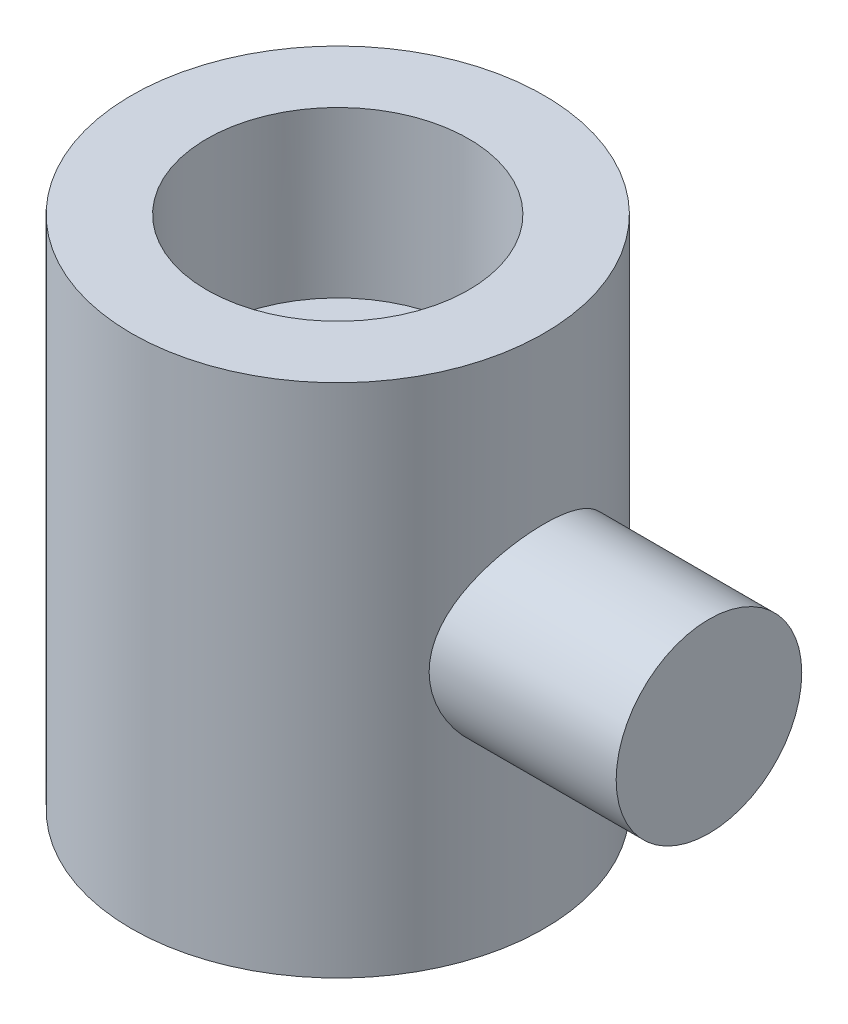
ISO-10303-21;
HEADER;
FILE_DESCRIPTION(('STEP AP214'),'2;1');
FILE_NAME('part.step','',(''),(''),'','','');
FILE_SCHEMA(('AUTOMOTIVE_DESIGN { 1 0 10303 214 1 1 1 1 }'));
ENDSEC;
DATA;
#1=APPLICATION_CONTEXT('core data for automotive mechanical design processes');
#2=APPLICATION_PROTOCOL_DEFINITION('international standard','automotive_design',2000,#1);
#3=PRODUCT_CONTEXT('',#1,'mechanical');
#4=PRODUCT('Part','Part','',(#3));
#5=PRODUCT_RELATED_PRODUCT_CATEGORY('part','',(#4));
#6=PRODUCT_DEFINITION_FORMATION('','',#4);
#7=PRODUCT_DEFINITION_CONTEXT('part definition',#1,'design');
#8=PRODUCT_DEFINITION('design','',#6,#7);
#9=PRODUCT_DEFINITION_SHAPE('','',#8);
#10=(LENGTH_UNIT() NAMED_UNIT(*) SI_UNIT(.MILLI.,.METRE.));
#11=(NAMED_UNIT(*) PLANE_ANGLE_UNIT() SI_UNIT($,.RADIAN.));
#12=(NAMED_UNIT(*) SI_UNIT($,.STERADIAN.) SOLID_ANGLE_UNIT());
#13=UNCERTAINTY_MEASURE_WITH_UNIT(LENGTH_MEASURE(1.E-05),#10,'distance_accuracy_value','');
#14=(GEOMETRIC_REPRESENTATION_CONTEXT(3) GLOBAL_UNCERTAINTY_ASSIGNED_CONTEXT((#13)) GLOBAL_UNIT_ASSIGNED_CONTEXT((#10,
#11,#12)) REPRESENTATION_CONTEXT('',''));
#15=CARTESIAN_POINT('',(0.,0.,0.));
#16=DIRECTION('',(0.,0.,1.));
#17=DIRECTION('',(1.,0.,0.));
#18=AXIS2_PLACEMENT_3D('',#15,#16,#17);
#19=CARTESIAN_POINT('',(0.,0.,0.));
#20=DIRECTION('',(0.,1.,0.));
#21=DIRECTION('',(0.,0.,1.));
#22=AXIS2_PLACEMENT_3D('',#19,#20,#21);
#23=CYLINDRICAL_SURFACE('',#22,6.35);
#24=CARTESIAN_POINT('',(0.,0.,0.));
#25=DIRECTION('',(0.,1.,0.));
#26=DIRECTION('',(0.,0.,1.));
#27=AXIS2_PLACEMENT_3D('',#24,#25,#26);
#28=CIRCLE('',#27,6.35);
#29=CARTESIAN_POINT('',(0.,0.,6.35));
#30=VERTEX_POINT('',#29);
#31=EDGE_CURVE('E102',#30,#30,#28,.T.);
#32=ORIENTED_EDGE('',*,*,#31,.F.);
#33=EDGE_LOOP('',(#32));
#34=FACE_BOUND('',#33,.T.);
#35=CARTESIAN_POINT('',(0.,8.,0.));
#36=DIRECTION('',(0.,1.,0.));
#37=DIRECTION('',(0.,0.,1.));
#38=AXIS2_PLACEMENT_3D('',#35,#36,#37);
#39=CIRCLE('',#38,6.35);
#40=CARTESIAN_POINT('',(0.,8.,6.35));
#41=VERTEX_POINT('',#40);
#42=EDGE_CURVE('E10',#41,#41,#39,.F.);
#43=ORIENTED_EDGE('',*,*,#42,.F.);
#44=EDGE_LOOP('',(#43));
#45=FACE_BOUND('',#44,.T.);
#46=ADVANCED_FACE('F35',(#34,#45),#23,.F.);
#47=CARTESIAN_POINT('',(0.,25.,0.));
#48=DIRECTION('',(0.,1.,0.));
#49=DIRECTION('',(0.,0.,1.));
#50=AXIS2_PLACEMENT_3D('',#47,#48,#49);
#51=CIRCLE('',#50,6.35);
#52=CARTESIAN_POINT('',(0.,25.,6.35));
#53=VERTEX_POINT('',#52);
#54=EDGE_CURVE('E105',#53,#53,#51,.T.);
#55=ORIENTED_EDGE('',*,*,#54,.T.);
#56=EDGE_LOOP('',(#55));
#57=FACE_BOUND('',#56,.T.);
#58=CARTESIAN_POINT('',(0.,17.,0.));
#59=DIRECTION('',(0.,-1.,0.));
#60=DIRECTION('',(0.,0.,-1.));
#61=AXIS2_PLACEMENT_3D('',#58,#59,#60);
#62=CIRCLE('',#61,6.35);
#63=CARTESIAN_POINT('',(0.,17.,-6.35));
#64=VERTEX_POINT('',#63);
#65=EDGE_CURVE('E43',#64,#64,#62,.F.);
#66=ORIENTED_EDGE('',*,*,#65,.F.);
#67=EDGE_LOOP('',(#66));
#68=FACE_BOUND('',#67,.T.);
#69=ADVANCED_FACE('F79',(#57,#68),#23,.F.);
#70=CARTESIAN_POINT('',(0.,25.,0.));
#71=DIRECTION('',(0.,-1.,0.));
#72=DIRECTION('',(0.,0.,-1.));
#73=AXIS2_PLACEMENT_3D('',#70,#71,#72);
#74=CYLINDRICAL_SURFACE('',#73,10.);
#75=CARTESIAN_POINT('',(0.,25.,0.));
#76=DIRECTION('',(0.,1.,0.));
#77=DIRECTION('',(0.,0.,1.));
#78=AXIS2_PLACEMENT_3D('',#75,#76,#77);
#79=CIRCLE('',#78,10.);
#80=CARTESIAN_POINT('',(0.,25.,10.));
#81=VERTEX_POINT('',#80);
#82=EDGE_CURVE('E51',#81,#81,#79,.T.);
#83=ORIENTED_EDGE('',*,*,#82,.F.);
#84=EDGE_LOOP('',(#83));
#85=FACE_BOUND('',#84,.T.);
#86=CARTESIAN_POINT('',(0.,0.,0.));
#87=DIRECTION('',(0.,1.,0.));
#88=DIRECTION('',(0.,0.,1.));
#89=AXIS2_PLACEMENT_3D('',#86,#87,#88);
#90=CIRCLE('',#89,10.);
#91=CARTESIAN_POINT('',(0.,0.,10.));
#92=VERTEX_POINT('',#91);
#93=EDGE_CURVE('E58',#92,#92,#90,.T.);
#94=ORIENTED_EDGE('',*,*,#93,.T.);
#95=EDGE_LOOP('',(#94));
#96=FACE_BOUND('',#95,.T.);
#97=CARTESIAN_POINT('',(8.93028554974588,12.5,4.5));
#98=CARTESIAN_POINT('',(8.93028665715097,12.3809771018192,4.49999900753477));
#99=CARTESIAN_POINT('',(8.9326734632785,12.2619234111279,4.49527089462175));
#100=CARTESIAN_POINT('',(8.94213851083985,12.0247021272078,4.4764121633059));
#101=CARTESIAN_POINT('',(8.94921948743679,11.9065350912285,4.46227606311057));
#102=CARTESIAN_POINT('',(8.96784321226705,11.6717983509885,4.42472929421759));
#103=CARTESIAN_POINT('',(8.97939455916732,11.5552321761409,4.40130074951643));
#104=CARTESIAN_POINT('',(9.00655829534415,11.3247442133586,4.34544149609485));
#105=CARTESIAN_POINT('',(9.02217241193892,11.2108235726875,4.31300695801135));
#106=CARTESIAN_POINT('',(9.07420370425744,10.8752969947015,4.20302832490161));
#107=CARTESIAN_POINT('',(9.1159252243151,10.6585879586014,4.11259084243044));
#108=CARTESIAN_POINT('',(9.20870863556652,10.2435826099227,3.90038575319806));
#109=CARTESIAN_POINT('',(9.25976938779201,10.0452840565305,3.77862196610834));
#110=CARTESIAN_POINT('',(9.36963133002868,9.65804603284918,3.49774535545532));
#111=CARTESIAN_POINT('',(9.42872112551387,9.47059368532893,3.33669453075979));
#112=CARTESIAN_POINT('',(9.5456549156315,9.12417827840537,2.98573014338581));
#113=CARTESIAN_POINT('',(9.60349837188839,8.96522732183702,2.79580438221028));
#114=CARTESIAN_POINT('',(9.68639291154486,8.74753383056168,2.48716850650077));
#115=CARTESIAN_POINT('',(9.71400608234226,8.67697168742286,2.37730211042744));
#116=CARTESIAN_POINT('',(9.76652368701515,8.54542970570811,2.15137980908607));
#117=CARTESIAN_POINT('',(9.79142924369947,8.48444589043501,2.0353264994276));
#118=CARTESIAN_POINT('',(9.83781866751917,8.37262014497248,1.7977696972914));
#119=CARTESIAN_POINT('',(9.85930235818906,8.3217787377925,1.67626592414737));
#120=CARTESIAN_POINT('',(9.89820028532643,8.23080090410251,1.42874443072233));
#121=CARTESIAN_POINT('',(9.91561664730457,8.19065888473351,1.30272910798264));
#122=CARTESIAN_POINT('',(9.94496285455116,8.12356989669552,1.05469306291911));
#123=CARTESIAN_POINT('',(9.95715608957633,8.09598338622807,0.932876307654807));
#124=CARTESIAN_POINT('',(9.97713029787575,8.05100730756276,0.687070058671677));
#125=CARTESIAN_POINT('',(9.98491330799465,8.03361303199551,0.563081595269153));
#126=CARTESIAN_POINT('',(9.99584972912315,8.00921712813126,0.313906694888997));
#127=CARTESIAN_POINT('',(9.99900403070532,8.00221350065037,0.188720493025134));
#128=CARTESIAN_POINT('',(10.0005934157122,7.99868109832876,-0.061826909703037));
#129=CARTESIAN_POINT('',(9.99902871976398,8.0021518337805,-0.18718810211212));
#130=CARTESIAN_POINT('',(9.9915049181316,8.01890414155341,-0.428151609034403));
#131=CARTESIAN_POINT('',(9.98586594610529,8.03147110627964,-0.543814434560289));
#132=CARTESIAN_POINT('',(9.97069688304592,8.06547324110202,-0.773607308321749));
#133=CARTESIAN_POINT('',(9.96116551774741,8.08691131539273,-0.887736841948393));
#134=CARTESIAN_POINT('',(9.93844700575279,8.13843321668214,-1.11361805535547));
#135=CARTESIAN_POINT('',(9.92526108171267,8.16851415227957,-1.22537051696029));
#136=CARTESIAN_POINT('',(9.89555170766099,8.23703300741736,-1.44584276385731));
#137=CARTESIAN_POINT('',(9.8790269806901,8.27547412482573,-1.55456137065954));
#138=CARTESIAN_POINT('',(9.82446359193428,8.40411855145098,-1.87832729139379));
#139=CARTESIAN_POINT('',(9.78177541505939,8.50690124401762,-2.08775323437735));
#140=CARTESIAN_POINT('',(9.68802825401248,8.74240492382162,-2.48682272493634));
#141=CARTESIAN_POINT('',(9.63696621102864,8.87513685762381,-2.67645900215365));
#142=CARTESIAN_POINT('',(9.52663253997494,9.1790989615667,-3.04688797551191));
#143=CARTESIAN_POINT('',(9.46703093606057,9.3525631597538,-3.22575119688883));
#144=CARTESIAN_POINT('',(9.34921055060214,9.72705310805077,-3.55282213552757));
#145=CARTESIAN_POINT('',(9.29099250519618,9.9280931613455,-3.70101384319466));
#146=CARTESIAN_POINT('',(9.20835673521302,10.2515842840767,-3.90021200591792));
#147=CARTESIAN_POINT('',(9.18107509001507,10.3657145983867,-3.96383241834423));
#148=CARTESIAN_POINT('',(9.12953957319977,10.5996095337373,-4.08112815709285));
#149=CARTESIAN_POINT('',(9.10528436283329,10.7193716310363,-4.13480788581937));
#150=CARTESIAN_POINT('',(9.06066733193017,10.963732082158,-4.231684749771));
#151=CARTESIAN_POINT('',(9.04030462801174,11.0883293309309,-4.27488426402036));
#152=CARTESIAN_POINT('',(9.00425885842613,11.3414038688838,-4.35029565228329));
#153=CARTESIAN_POINT('',(8.98857317044228,11.469878939171,-4.38251368486727));
#154=CARTESIAN_POINT('',(8.96344502002484,11.7204134214958,-4.43366731500246));
#155=CARTESIAN_POINT('',(8.95363690946856,11.8422764069857,-4.45338670000343));
#156=CARTESIAN_POINT('',(8.93897266484813,12.0874538236458,-4.48274907709633));
#157=CARTESIAN_POINT('',(8.93411417496691,12.2107675360317,-4.49239686291177));
#158=CARTESIAN_POINT('',(8.92953097805595,12.4578442420145,-4.50150005926685));
#159=CARTESIAN_POINT('',(8.92980535730787,12.5816071517265,-4.50095728386057));
#160=CARTESIAN_POINT('',(8.93547451737557,12.8285452534726,-4.48969202553159));
#161=CARTESIAN_POINT('',(8.94086908504294,12.9517204697572,-4.47896996636246));
#162=CARTESIAN_POINT('',(8.95593827132171,13.1866159659197,-4.44875588434577));
#163=CARTESIAN_POINT('',(8.96523386943642,13.2984609447477,-4.43003834306674));
#164=CARTESIAN_POINT('',(8.9876776099706,13.5200633476093,-4.38432319986805));
#165=CARTESIAN_POINT('',(9.00082699589543,13.629820085636,-4.35732292521943));
#166=CARTESIAN_POINT('',(9.04548361042607,13.9548790072266,-4.264273499369));
#167=CARTESIAN_POINT('',(9.08221114536897,14.1661401399125,-4.18615344015513));
#168=CARTESIAN_POINT('',(9.16743093467138,14.5821304550303,-3.99617986427354));
#169=CARTESIAN_POINT('',(9.21637923213784,14.7861348594827,-3.88296336538252));
#170=CARTESIAN_POINT('',(9.31997910091821,15.173359094166,-3.62725765171876));
#171=CARTESIAN_POINT('',(9.37463338628403,15.3565689462045,-3.4847544752462));
#172=CARTESIAN_POINT('',(9.48992530715003,15.7156493144412,-3.15818793218834));
#173=CARTESIAN_POINT('',(9.55062501945566,15.8890465963552,-2.9714220255475));
#174=CARTESIAN_POINT('',(9.66635831073104,16.2026702844823,-2.57001746658504));
#175=CARTESIAN_POINT('',(9.72139099794533,16.3428914746413,-2.35537443953701));
#176=CARTESIAN_POINT('',(9.79550236993352,16.5255396923746,-2.01540958273013));
#177=CARTESIAN_POINT('',(9.81890503562329,16.5820417789123,-1.89839259577603));
#178=CARTESIAN_POINT('',(9.86211093581397,16.6849038274661,-1.65936096014551));
#179=CARTESIAN_POINT('',(9.88191575026122,16.7312682431295,-1.53734853413142));
#180=CARTESIAN_POINT('',(9.91733519374267,16.8133404614763,-1.28925049807939));
#181=CARTESIAN_POINT('',(9.93295128426302,16.8490519815465,-1.16316632596105));
#182=CARTESIAN_POINT('',(9.95952718980977,16.9094124866654,-0.907896241975941));
#183=CARTESIAN_POINT('',(9.97048742892953,16.9340624793007,-0.778710613748413));
#184=CARTESIAN_POINT('',(9.98673721521934,16.9704766848534,-0.528687734902864));
#185=CARTESIAN_POINT('',(9.99240748499232,16.9831076377592,-0.408000717260473));
#186=CARTESIAN_POINT('',(9.99935878553348,16.9985803225299,-0.165829731802703));
#187=CARTESIAN_POINT('',(10.0006383479803,17.0014187796324,-0.0443455109949142));
#188=CARTESIAN_POINT('',(9.99876872808293,16.9972635346979,0.198347492815685));
#189=CARTESIAN_POINT('',(9.99562215866124,16.9902756335536,0.319556396050329));
#190=CARTESIAN_POINT('',(9.98498975551294,16.9665570914885,0.560868239420997));
#191=CARTESIAN_POINT('',(9.97750231256671,16.9498228374544,0.680970752620499));
#192=CARTESIAN_POINT('',(9.95883517526634,16.9078039998369,0.913544590607945));
#193=CARTESIAN_POINT('',(9.94784454379403,16.8829559156289,1.02611011152605));
#194=CARTESIAN_POINT('',(9.92237086323385,16.8248256798918,1.2486513480595));
#195=CARTESIAN_POINT('',(9.9078866014221,16.7915405994718,1.35862614979072));
#196=CARTESIAN_POINT('',(9.85968430367424,16.6794725441144,1.68356833021549));
#197=CARTESIAN_POINT('',(9.8212004049457,16.5884413675896,1.89374673904315));
#198=CARTESIAN_POINT('',(9.73298346827671,16.3718428130098,2.30553808893879));
#199=CARTESIAN_POINT('',(9.6828159403156,16.2448846112472,2.50631783562241));
#200=CARTESIAN_POINT('',(9.57692352675313,15.9618875035283,2.88464086275277));
#201=CARTESIAN_POINT('',(9.52119625004324,15.8058360600168,3.06217406888131));
#202=CARTESIAN_POINT('',(9.40470307529147,15.4543424822101,3.40393255794247));
#203=CARTESIAN_POINT('',(9.34389437738613,15.2567346122285,3.56591825069148));
#204=CARTESIAN_POINT('',(9.22839486688382,14.8354090940555,3.85500300853971));
#205=CARTESIAN_POINT('',(9.17370800061381,14.6116747916188,3.98207964601505));
#206=CARTESIAN_POINT('',(9.10133642103359,14.2600209811457,4.14357043618462));
#207=CARTESIAN_POINT('',(9.07875805969373,14.1396603105243,4.19267149619283));
#208=CARTESIAN_POINT('',(9.03770834780585,13.8945372971886,4.28044156255874));
#209=CARTESIAN_POINT('',(9.01923493259433,13.7697772040058,4.31911581538191));
#210=CARTESIAN_POINT('',(8.98715048842999,13.517123756216,4.38548550050348));
#211=CARTESIAN_POINT('',(8.97352672157999,13.3892395667874,4.41320971506873));
#212=CARTESIAN_POINT('',(8.95164017650579,13.1311578653708,4.45743804472096));
#213=CARTESIAN_POINT('',(8.94337339799171,13.0009621543116,4.47395053252014));
#214=CARTESIAN_POINT('',(8.93540675317126,12.8086863999874,4.48982530765898));
#215=CARTESIAN_POINT('',(8.9334884364361,12.7470311943061,4.49363906809911));
#216=CARTESIAN_POINT('',(8.93092752690323,12.6235867621967,4.49872671240046));
#217=CARTESIAN_POINT('',(8.93028497477331,12.5617975315591,4.50000051529497));
#218=CARTESIAN_POINT('',(8.93028554974588,12.5,4.5));
#219=B_SPLINE_CURVE_WITH_KNOTS('',3,(#97,#98,#99,#100,#101,#102,#103,#104,#105,#106,#107,#108,
#109,#110,#111,#112,#113,#114,#115,#116,#117,#118,#119,#120,#121,#122,#123,#124,#125,#126,#127,
#128,#129,#130,#131,#132,#133,#134,#135,#136,#137,#138,#139,#140,#141,#142,#143,#144,#145,#146,
#147,#148,#149,#150,#151,#152,#153,#154,#155,#156,#157,#158,#159,#160,#161,#162,#163,#164,#165,
#166,#167,#168,#169,#170,#171,#172,#173,#174,#175,#176,#177,#178,#179,#180,#181,#182,#183,#184,
#185,#186,#187,#188,#189,#190,#191,#192,#193,#194,#195,#196,#197,#198,#199,#200,#201,#202,#203,
#204,#205,#206,#207,#208,#209,#210,#211,#212,#213,#214,#215,#216,#217,#218),.UNSPECIFIED.,.T.,
.F.,(4,2,2,2,2,2,2,2,2,2,2,2,2,2,2,2,2,2,2,2,2,2,2,2,2,2,2,2,2,2,2,2,2,2,2,2,2,2,2,2,2,2,2,2,2,
2,2,2,2,2,2,2,2,2,2,2,2,2,2,2,4),(0.,0.357004456178927,0.714217112016315,1.07212030183724,
1.43017590633537,2.14225562191466,2.85424855347645,3.61334582113141,4.37276467250656,
4.77272074789878,5.17251032944645,5.57232052145468,5.9719213101763,6.34790934522507,
6.72372358988203,7.09946551765798,7.47518987865616,7.82421803902561,8.17336055359469,
8.52238640101088,8.87154599047927,9.57974647184415,10.28820622377,11.0534929543513,
11.8191781394317,12.219190548485,12.6190253792179,13.0187693617442,13.4182887919003,
13.7892978185709,14.1601301774966,14.5308965240052,14.901647436552,15.2425875951412,
15.5836378865619,16.2652282849523,16.977571188073,17.6902544741002,18.4726889172695,
19.2552462957291,19.6509088614391,20.046397255204,20.44174747923,20.8370616837698,
21.2010314842897,21.565122990162,21.9289996484551,22.2930112870055,22.6399982665907,
22.9871058675602,23.6807366034793,24.4061360590582,25.1318488467476,25.9162900654335,
26.7012340827479,27.0965923673836,27.4917513464008,27.8858646218535,28.2796832560689,
28.4650365892845,28.6503958309487),.UNSPECIFIED.);
#220=CARTESIAN_POINT('',(8.93028554974588,12.5,4.5));
#221=VERTEX_POINT('',#220);
#222=EDGE_CURVE('E47',#221,#221,#219,.T.);
#223=ORIENTED_EDGE('',*,*,#222,.F.);
#224=EDGE_LOOP('',(#223));
#225=FACE_BOUND('',#224,.T.);
#226=ADVANCED_FACE('F37',(#85,#96,#225),#74,.T.);
#227=CARTESIAN_POINT('',(0.,25.,0.));
#228=DIRECTION('',(0.,1.,0.));
#229=DIRECTION('',(0.,0.,1.));
#230=AXIS2_PLACEMENT_3D('',#227,#228,#229);
#231=PLANE('',#230);
#232=ORIENTED_EDGE('',*,*,#54,.F.);
#233=EDGE_LOOP('',(#232));
#234=FACE_BOUND('',#233,.T.);
#235=ORIENTED_EDGE('',*,*,#82,.T.);
#236=EDGE_LOOP('',(#235));
#237=FACE_BOUND('',#236,.T.);
#238=ADVANCED_FACE('F69',(#234,#237),#231,.T.);
#239=CARTESIAN_POINT('',(0.,0.,0.));
#240=DIRECTION('',(0.,1.,0.));
#241=DIRECTION('',(0.,0.,1.));
#242=AXIS2_PLACEMENT_3D('',#239,#240,#241);
#243=PLANE('',#242);
#244=ORIENTED_EDGE('',*,*,#31,.T.);
#245=EDGE_LOOP('',(#244));
#246=FACE_BOUND('',#245,.T.);
#247=ORIENTED_EDGE('',*,*,#93,.F.);
#248=EDGE_LOOP('',(#247));
#249=FACE_BOUND('',#248,.T.);
#250=ADVANCED_FACE('F66',(#246,#249),#243,.F.);
#251=CARTESIAN_POINT('',(18.,12.5,0.));
#252=DIRECTION('',(-1.,0.,0.));
#253=DIRECTION('',(0.,0.,1.));
#254=AXIS2_PLACEMENT_3D('',#251,#252,#253);
#255=CYLINDRICAL_SURFACE('',#254,4.5);
#256=CARTESIAN_POINT('',(18.,12.5,0.));
#257=DIRECTION('',(1.,0.,0.));
#258=DIRECTION('',(0.,0.,-1.));
#259=AXIS2_PLACEMENT_3D('',#256,#257,#258);
#260=CIRCLE('',#259,4.5);
#261=CARTESIAN_POINT('',(18.,12.5,-4.5));
#262=VERTEX_POINT('',#261);
#263=EDGE_CURVE('E101',#262,#262,#260,.T.);
#264=ORIENTED_EDGE('',*,*,#263,.F.);
#265=EDGE_LOOP('',(#264));
#266=FACE_BOUND('',#265,.T.);
#267=ORIENTED_EDGE('',*,*,#222,.T.);
#268=EDGE_LOOP('',(#267));
#269=FACE_BOUND('',#268,.T.);
#270=ADVANCED_FACE('F60',(#266,#269),#255,.T.);
#271=CARTESIAN_POINT('',(18.,12.5,0.));
#272=DIRECTION('',(1.,0.,0.));
#273=DIRECTION('',(0.,0.,-1.));
#274=AXIS2_PLACEMENT_3D('',#271,#272,#273);
#275=PLANE('',#274);
#276=ORIENTED_EDGE('',*,*,#263,.T.);
#277=EDGE_LOOP('',(#276));
#278=FACE_BOUND('',#277,.T.);
#279=ADVANCED_FACE('F65',(#278),#275,.T.);
#280=CARTESIAN_POINT('',(-7.5,17.,6.5));
#281=DIRECTION('',(0.,-1.,0.));
#282=DIRECTION('',(0.,0.,-1.));
#283=AXIS2_PLACEMENT_3D('',#280,#281,#282);
#284=PLANE('',#283);
#285=ORIENTED_EDGE('',*,*,#65,.T.);
#286=EDGE_LOOP('',(#285));
#287=FACE_BOUND('',#286,.T.);
#288=ADVANCED_FACE('F91',(#287),#284,.F.);
#289=CARTESIAN_POINT('',(-7.5,8.,6.5));
#290=DIRECTION('',(0.,1.,0.));
#291=DIRECTION('',(0.,0.,1.));
#292=AXIS2_PLACEMENT_3D('',#289,#290,#291);
#293=PLANE('',#292);
#294=ORIENTED_EDGE('',*,*,#42,.T.);
#295=EDGE_LOOP('',(#294));
#296=FACE_BOUND('',#295,.T.);
#297=ADVANCED_FACE('F88',(#296),#293,.F.);
#298=CLOSED_SHELL('',(#46,#69,#226,#238,#250,#270,#279,#288,#297));
#299=MANIFOLD_SOLID_BREP('B2',#298);
#300=ADVANCED_BREP_SHAPE_REPRESENTATION('',(#18,#299),#14);
#301=SHAPE_DEFINITION_REPRESENTATION(#9,#300);
ENDSEC;
END-ISO-10303-21;
